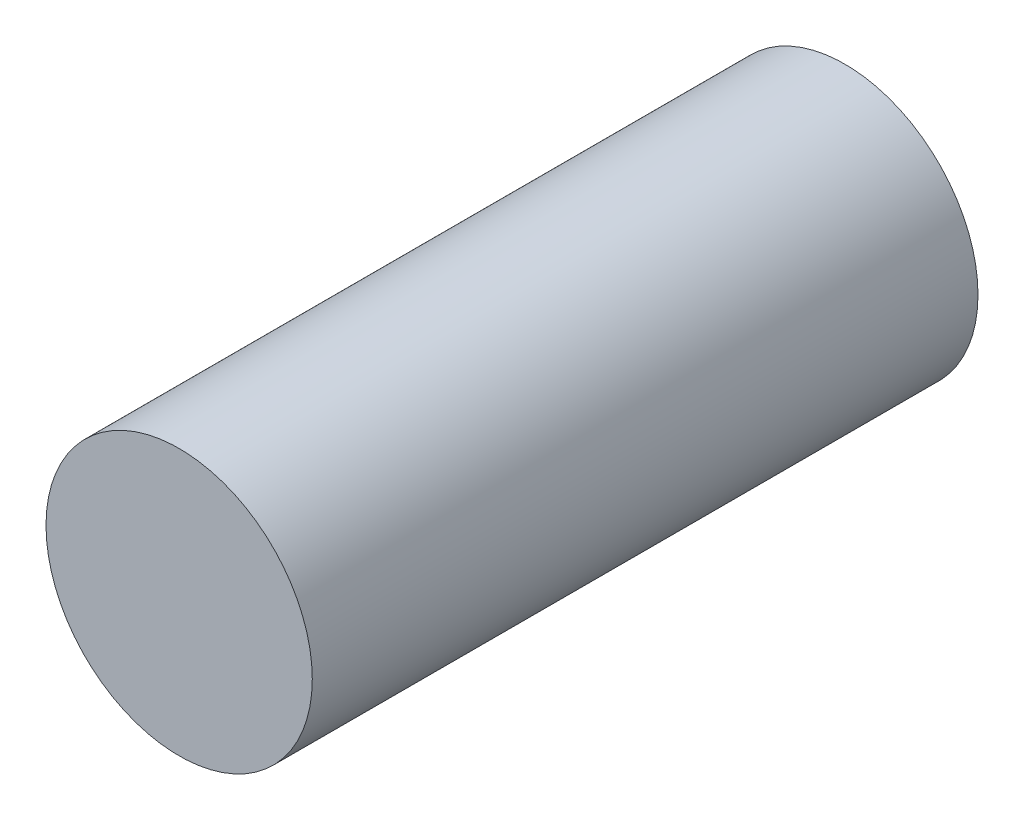
ISO-10303-21;
HEADER;
FILE_DESCRIPTION(('STEP AP214'),'2;1');
FILE_NAME('part.step','',(''),(''),'','','');
FILE_SCHEMA(('AUTOMOTIVE_DESIGN { 1 0 10303 214 1 1 1 1 }'));
ENDSEC;
DATA;
#1=APPLICATION_CONTEXT('core data for automotive mechanical design processes');
#2=APPLICATION_PROTOCOL_DEFINITION('international standard','automotive_design',2000,#1);
#3=PRODUCT_CONTEXT('',#1,'mechanical');
#4=PRODUCT('Part','Part','',(#3));
#5=PRODUCT_RELATED_PRODUCT_CATEGORY('part','',(#4));
#6=PRODUCT_DEFINITION_FORMATION('','',#4);
#7=PRODUCT_DEFINITION_CONTEXT('part definition',#1,'design');
#8=PRODUCT_DEFINITION('design','',#6,#7);
#9=PRODUCT_DEFINITION_SHAPE('','',#8);
#10=(LENGTH_UNIT() NAMED_UNIT(*) SI_UNIT(.MILLI.,.METRE.));
#11=(NAMED_UNIT(*) PLANE_ANGLE_UNIT() SI_UNIT($,.RADIAN.));
#12=(NAMED_UNIT(*) SI_UNIT($,.STERADIAN.) SOLID_ANGLE_UNIT());
#13=UNCERTAINTY_MEASURE_WITH_UNIT(LENGTH_MEASURE(1.E-05),#10,'distance_accuracy_value','');
#14=(GEOMETRIC_REPRESENTATION_CONTEXT(3) GLOBAL_UNCERTAINTY_ASSIGNED_CONTEXT((#13)) GLOBAL_UNIT_ASSIGNED_CONTEXT((#10,
#11,#12)) REPRESENTATION_CONTEXT('',''));
#15=CARTESIAN_POINT('',(0.,0.,0.));
#16=DIRECTION('',(0.,0.,1.));
#17=DIRECTION('',(1.,0.,0.));
#18=AXIS2_PLACEMENT_3D('',#15,#16,#17);
#19=CARTESIAN_POINT('',(0.,0.,127.));
#20=DIRECTION('',(0.,0.,-1.));
#21=DIRECTION('',(-1.,0.,0.));
#22=AXIS2_PLACEMENT_3D('',#19,#20,#21);
#23=CYLINDRICAL_SURFACE('',#22,25.4);
#24=CARTESIAN_POINT('',(0.,0.,127.));
#25=DIRECTION('',(0.,0.,1.));
#26=DIRECTION('',(1.,0.,0.));
#27=AXIS2_PLACEMENT_3D('',#24,#25,#26);
#28=CIRCLE('',#27,25.4);
#29=CARTESIAN_POINT('',(25.4,0.,127.));
#30=VERTEX_POINT('',#29);
#31=EDGE_CURVE('E10',#30,#30,#28,.T.);
#32=ORIENTED_EDGE('',*,*,#31,.F.);
#33=EDGE_LOOP('',(#32));
#34=FACE_BOUND('',#33,.T.);
#35=CARTESIAN_POINT('',(0.,0.,0.));
#36=DIRECTION('',(0.,0.,1.));
#37=DIRECTION('',(1.,0.,0.));
#38=AXIS2_PLACEMENT_3D('',#35,#36,#37);
#39=CIRCLE('',#38,25.4);
#40=CARTESIAN_POINT('',(25.4,0.,0.));
#41=VERTEX_POINT('',#40);
#42=EDGE_CURVE('E42',#41,#41,#39,.T.);
#43=ORIENTED_EDGE('',*,*,#42,.T.);
#44=EDGE_LOOP('',(#43));
#45=FACE_BOUND('',#44,.T.);
#46=ADVANCED_FACE('F39',(#34,#45),#23,.T.);
#47=CARTESIAN_POINT('',(0.,0.,127.));
#48=DIRECTION('',(0.,0.,1.));
#49=DIRECTION('',(1.,0.,0.));
#50=AXIS2_PLACEMENT_3D('',#47,#48,#49);
#51=PLANE('',#50);
#52=ORIENTED_EDGE('',*,*,#31,.T.);
#53=EDGE_LOOP('',(#52));
#54=FACE_BOUND('',#53,.T.);
#55=ADVANCED_FACE('F54',(#54),#51,.T.);
#56=CARTESIAN_POINT('',(0.,0.,0.));
#57=DIRECTION('',(0.,0.,1.));
#58=DIRECTION('',(1.,0.,0.));
#59=AXIS2_PLACEMENT_3D('',#56,#57,#58);
#60=PLANE('',#59);
#61=ORIENTED_EDGE('',*,*,#42,.F.);
#62=EDGE_LOOP('',(#61));
#63=FACE_BOUND('',#62,.T.);
#64=ADVANCED_FACE('F52',(#63),#60,.F.);
#65=CLOSED_SHELL('',(#46,#55,#64));
#66=MANIFOLD_SOLID_BREP('B2',#65);
#67=ADVANCED_BREP_SHAPE_REPRESENTATION('',(#18,#66),#14);
#68=SHAPE_DEFINITION_REPRESENTATION(#9,#67);
ENDSEC;
END-ISO-10303-21;
